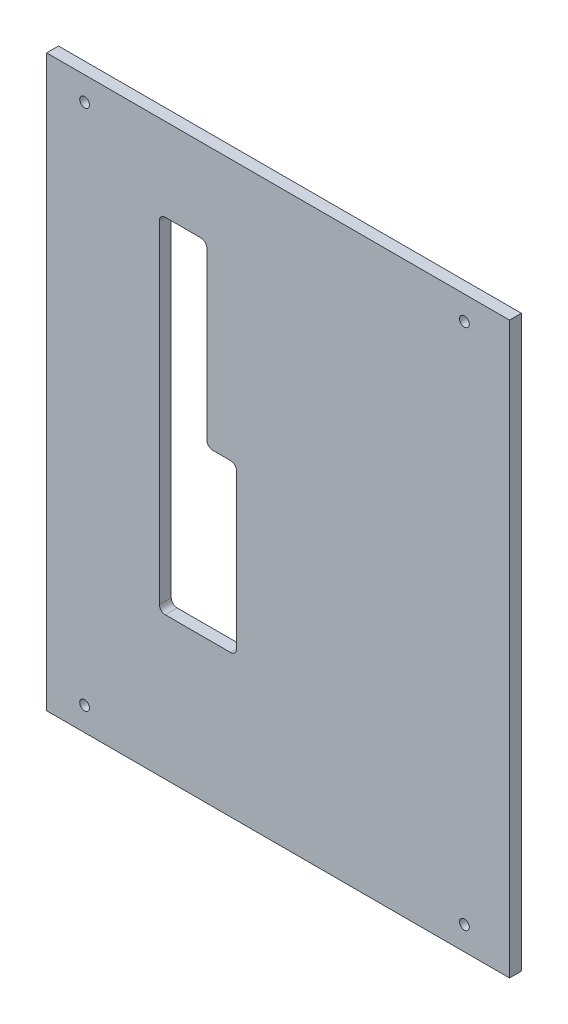
ISO-10303-21;
HEADER;
FILE_DESCRIPTION(('STEP AP214'),'2;1');
FILE_NAME('part.step','',(''),(''),'','','');
FILE_SCHEMA(('AUTOMOTIVE_DESIGN { 1 0 10303 214 1 1 1 1 }'));
ENDSEC;
DATA;
#1=APPLICATION_CONTEXT('core data for automotive mechanical design processes');
#2=APPLICATION_PROTOCOL_DEFINITION('international standard','automotive_design',2000,#1);
#3=PRODUCT_CONTEXT('',#1,'mechanical');
#4=PRODUCT('Part','Part','',(#3));
#5=PRODUCT_RELATED_PRODUCT_CATEGORY('part','',(#4));
#6=PRODUCT_DEFINITION_FORMATION('','',#4);
#7=PRODUCT_DEFINITION_CONTEXT('part definition',#1,'design');
#8=PRODUCT_DEFINITION('design','',#6,#7);
#9=PRODUCT_DEFINITION_SHAPE('','',#8);
#10=(LENGTH_UNIT() NAMED_UNIT(*) SI_UNIT(.MILLI.,.METRE.));
#11=(NAMED_UNIT(*) PLANE_ANGLE_UNIT() SI_UNIT($,.RADIAN.));
#12=(NAMED_UNIT(*) SI_UNIT($,.STERADIAN.) SOLID_ANGLE_UNIT());
#13=UNCERTAINTY_MEASURE_WITH_UNIT(LENGTH_MEASURE(1.E-05),#10,'distance_accuracy_value','');
#14=(GEOMETRIC_REPRESENTATION_CONTEXT(3) GLOBAL_UNCERTAINTY_ASSIGNED_CONTEXT((#13)) GLOBAL_UNIT_ASSIGNED_CONTEXT((#10,
#11,#12)) REPRESENTATION_CONTEXT('',''));
#15=CARTESIAN_POINT('',(0.,0.,0.));
#16=DIRECTION('',(0.,0.,1.));
#17=DIRECTION('',(1.,0.,0.));
#18=AXIS2_PLACEMENT_3D('',#15,#16,#17);
#19=CARTESIAN_POINT('',(-120.,0.,5.));
#20=DIRECTION('',(-1.,0.,0.));
#21=DIRECTION('',(0.,0.,1.));
#22=AXIS2_PLACEMENT_3D('',#19,#20,#21);
#23=PLANE('',#22);
#24=DIRECTION('',(0.,1.,0.));
#25=VECTOR('',#24,1.);
#26=CARTESIAN_POINT('',(-120.,0.,0.));
#27=LINE('',#26,#25);
#28=CARTESIAN_POINT('',(-120.,-120.,0.));
#29=VERTEX_POINT('',#28);
#30=CARTESIAN_POINT('',(-120.,120.,0.));
#31=VERTEX_POINT('',#30);
#32=EDGE_CURVE('E153',#29,#31,#27,.T.);
#33=ORIENTED_EDGE('',*,*,#32,.F.);
#34=DIRECTION('',(0.,0.,-1.));
#35=VECTOR('',#34,1.);
#36=CARTESIAN_POINT('',(-120.,-120.,5.));
#37=LINE('',#36,#35);
#38=CARTESIAN_POINT('',(-120.,-120.,5.));
#39=VERTEX_POINT('',#38);
#40=EDGE_CURVE('E149',#39,#29,#37,.T.);
#41=ORIENTED_EDGE('',*,*,#40,.F.);
#42=DIRECTION('',(0.,1.,0.));
#43=VECTOR('',#42,1.);
#44=CARTESIAN_POINT('',(-120.,0.,5.));
#45=LINE('',#44,#43);
#46=CARTESIAN_POINT('',(-120.,120.,5.));
#47=VERTEX_POINT('',#46);
#48=EDGE_CURVE('E151',#39,#47,#45,.T.);
#49=ORIENTED_EDGE('',*,*,#48,.T.);
#50=DIRECTION('',(0.,0.,-1.));
#51=VECTOR('',#50,1.);
#52=CARTESIAN_POINT('',(-120.,120.,5.));
#53=LINE('',#52,#51);
#54=EDGE_CURVE('E182',#47,#31,#53,.T.);
#55=ORIENTED_EDGE('',*,*,#54,.T.);
#56=EDGE_LOOP('',(#33,#41,#49,#55));
#57=FACE_BOUND('',#56,.T.);
#58=ADVANCED_FACE('F35',(#57),#23,.T.);
#59=CARTESIAN_POINT('',(0.,-120.,5.));
#60=DIRECTION('',(0.,-1.,0.));
#61=DIRECTION('',(1.,0.,0.));
#62=AXIS2_PLACEMENT_3D('',#59,#60,#61);
#63=PLANE('',#62);
#64=DIRECTION('',(-1.,0.,0.));
#65=VECTOR('',#64,1.);
#66=CARTESIAN_POINT('',(0.,-120.,0.));
#67=LINE('',#66,#65);
#68=CARTESIAN_POINT('',(75.,-120.,0.));
#69=VERTEX_POINT('',#68);
#70=EDGE_CURVE('E210',#69,#29,#67,.T.);
#71=ORIENTED_EDGE('',*,*,#70,.F.);
#72=DIRECTION('',(0.,0.,-1.));
#73=VECTOR('',#72,1.);
#74=CARTESIAN_POINT('',(75.,-120.,5.));
#75=LINE('',#74,#73);
#76=CARTESIAN_POINT('',(75.,-120.,5.));
#77=VERTEX_POINT('',#76);
#78=EDGE_CURVE('E159',#77,#69,#75,.T.);
#79=ORIENTED_EDGE('',*,*,#78,.F.);
#80=DIRECTION('',(-1.,0.,0.));
#81=VECTOR('',#80,1.);
#82=CARTESIAN_POINT('',(0.,-120.,5.));
#83=LINE('',#82,#81);
#84=EDGE_CURVE('E166',#77,#39,#83,.T.);
#85=ORIENTED_EDGE('',*,*,#84,.T.);
#86=ORIENTED_EDGE('',*,*,#40,.T.);
#87=EDGE_LOOP('',(#71,#79,#85,#86));
#88=FACE_BOUND('',#87,.T.);
#89=ADVANCED_FACE('F171',(#88),#63,.T.);
#90=CARTESIAN_POINT('',(75.,0.,5.));
#91=DIRECTION('',(-1.,0.,0.));
#92=DIRECTION('',(0.,0.,1.));
#93=AXIS2_PLACEMENT_3D('',#90,#91,#92);
#94=PLANE('',#93);
#95=DIRECTION('',(0.,1.,0.));
#96=VECTOR('',#95,1.);
#97=CARTESIAN_POINT('',(75.,0.,0.));
#98=LINE('',#97,#96);
#99=CARTESIAN_POINT('',(75.,120.,0.));
#100=VERTEX_POINT('',#99);
#101=EDGE_CURVE('E212',#69,#100,#98,.T.);
#102=ORIENTED_EDGE('',*,*,#101,.T.);
#103=DIRECTION('',(0.,0.,-1.));
#104=VECTOR('',#103,1.);
#105=CARTESIAN_POINT('',(75.,120.,5.));
#106=LINE('',#105,#104);
#107=CARTESIAN_POINT('',(75.,120.,5.));
#108=VERTEX_POINT('',#107);
#109=EDGE_CURVE('E223',#108,#100,#106,.T.);
#110=ORIENTED_EDGE('',*,*,#109,.F.);
#111=DIRECTION('',(0.,1.,0.));
#112=VECTOR('',#111,1.);
#113=CARTESIAN_POINT('',(75.,0.,5.));
#114=LINE('',#113,#112);
#115=EDGE_CURVE('E173',#77,#108,#114,.T.);
#116=ORIENTED_EDGE('',*,*,#115,.F.);
#117=ORIENTED_EDGE('',*,*,#78,.T.);
#118=EDGE_LOOP('',(#102,#110,#116,#117));
#119=FACE_BOUND('',#118,.T.);
#120=ADVANCED_FACE('F332',(#119),#94,.F.);
#121=CARTESIAN_POINT('',(0.,85.,5.));
#122=DIRECTION('',(0.,-1.,0.));
#123=DIRECTION('',(1.,0.,0.));
#124=AXIS2_PLACEMENT_3D('',#121,#122,#123);
#125=PLANE('',#124);
#126=DIRECTION('',(-1.,0.,0.));
#127=VECTOR('',#126,1.);
#128=CARTESIAN_POINT('',(0.,85.,0.));
#129=LINE('',#128,#127);
#130=CARTESIAN_POINT('',(-55.0000000000001,85.,0.));
#131=VERTEX_POINT('',#130);
#132=CARTESIAN_POINT('',(-70.,85.,0.));
#133=VERTEX_POINT('',#132);
#134=EDGE_CURVE('E183',#131,#133,#129,.T.);
#135=ORIENTED_EDGE('',*,*,#134,.F.);
#136=DIRECTION('',(0.,0.,-1.));
#137=VECTOR('',#136,1.);
#138=CARTESIAN_POINT('',(-55.0000000000001,85.,5.));
#139=LINE('',#138,#137);
#140=CARTESIAN_POINT('',(-55.0000000000001,85.,5.));
#141=VERTEX_POINT('',#140);
#142=EDGE_CURVE('E249',#131,#141,#139,.F.);
#143=ORIENTED_EDGE('',*,*,#142,.T.);
#144=DIRECTION('',(-1.,0.,0.));
#145=VECTOR('',#144,1.);
#146=CARTESIAN_POINT('',(0.,85.,5.));
#147=LINE('',#146,#145);
#148=CARTESIAN_POINT('',(-70.,85.,5.));
#149=VERTEX_POINT('',#148);
#150=EDGE_CURVE('E221',#141,#149,#147,.T.);
#151=ORIENTED_EDGE('',*,*,#150,.T.);
#152=DIRECTION('',(0.,0.,-1.));
#153=VECTOR('',#152,1.);
#154=CARTESIAN_POINT('',(-70.,85.,5.));
#155=LINE('',#154,#153);
#156=EDGE_CURVE('E246',#149,#133,#155,.T.);
#157=ORIENTED_EDGE('',*,*,#156,.T.);
#158=EDGE_LOOP('',(#135,#143,#151,#157));
#159=FACE_BOUND('',#158,.T.);
#160=ADVANCED_FACE('F361',(#159),#125,.T.);
#161=CARTESIAN_POINT('',(-52.5,0.,5.));
#162=DIRECTION('',(1.,0.,0.));
#163=DIRECTION('',(0.,1.,0.));
#164=AXIS2_PLACEMENT_3D('',#161,#162,#163);
#165=PLANE('',#164);
#166=DIRECTION('',(0.,-1.,0.));
#167=VECTOR('',#166,1.);
#168=CARTESIAN_POINT('',(-52.5,0.,5.));
#169=LINE('',#168,#167);
#170=CARTESIAN_POINT('',(-52.5000000000001,82.5,5.));
#171=VERTEX_POINT('',#170);
#172=CARTESIAN_POINT('',(-52.5,12.5,5.));
#173=VERTEX_POINT('',#172);
#174=EDGE_CURVE('E298',#171,#173,#169,.T.);
#175=ORIENTED_EDGE('',*,*,#174,.F.);
#176=DIRECTION('',(0.,0.,-1.));
#177=VECTOR('',#176,1.);
#178=CARTESIAN_POINT('',(-52.5000000000001,82.5,5.));
#179=LINE('',#178,#177);
#180=CARTESIAN_POINT('',(-52.5000000000001,82.5,0.));
#181=VERTEX_POINT('',#180);
#182=EDGE_CURVE('E243',#171,#181,#179,.T.);
#183=ORIENTED_EDGE('',*,*,#182,.T.);
#184=DIRECTION('',(0.,-1.,0.));
#185=VECTOR('',#184,1.);
#186=CARTESIAN_POINT('',(-52.5,0.,0.));
#187=LINE('',#186,#185);
#188=CARTESIAN_POINT('',(-52.5,12.5,0.));
#189=VERTEX_POINT('',#188);
#190=EDGE_CURVE('E186',#181,#189,#187,.T.);
#191=ORIENTED_EDGE('',*,*,#190,.T.);
#192=DIRECTION('',(0.,0.,-1.));
#193=VECTOR('',#192,1.);
#194=CARTESIAN_POINT('',(-52.5,12.5,5.));
#195=LINE('',#194,#193);
#196=EDGE_CURVE('E241',#189,#173,#195,.F.);
#197=ORIENTED_EDGE('',*,*,#196,.T.);
#198=EDGE_LOOP('',(#175,#183,#191,#197));
#199=FACE_BOUND('',#198,.T.);
#200=ADVANCED_FACE('F358',(#199),#165,.F.);
#201=CARTESIAN_POINT('',(0.,9.99999999999998,5.));
#202=DIRECTION('',(0.,1.,0.));
#203=DIRECTION('',(0.,0.,1.));
#204=AXIS2_PLACEMENT_3D('',#201,#202,#203);
#205=PLANE('',#204);
#206=DIRECTION('',(1.,0.,0.));
#207=VECTOR('',#206,1.);
#208=CARTESIAN_POINT('',(0.,9.99999999999998,0.));
#209=LINE('',#208,#207);
#210=CARTESIAN_POINT('',(-50.,9.99999999999998,0.));
#211=VERTEX_POINT('',#210);
#212=CARTESIAN_POINT('',(-42.5,9.99999999999998,0.));
#213=VERTEX_POINT('',#212);
#214=EDGE_CURVE('E189',#211,#213,#209,.T.);
#215=ORIENTED_EDGE('',*,*,#214,.T.);
#216=DIRECTION('',(0.,0.,-1.));
#217=VECTOR('',#216,1.);
#218=CARTESIAN_POINT('',(-42.5,9.99999999999998,5.));
#219=LINE('',#218,#217);
#220=CARTESIAN_POINT('',(-42.5,9.99999999999998,5.));
#221=VERTEX_POINT('',#220);
#222=EDGE_CURVE('E50',#213,#221,#219,.F.);
#223=ORIENTED_EDGE('',*,*,#222,.T.);
#224=DIRECTION('',(1.,0.,0.));
#225=VECTOR('',#224,1.);
#226=CARTESIAN_POINT('',(0.,9.99999999999998,5.));
#227=LINE('',#226,#225);
#228=CARTESIAN_POINT('',(-50.,9.99999999999998,5.));
#229=VERTEX_POINT('',#228);
#230=EDGE_CURVE('E289',#229,#221,#227,.T.);
#231=ORIENTED_EDGE('',*,*,#230,.F.);
#232=DIRECTION('',(0.,0.,-1.));
#233=VECTOR('',#232,1.);
#234=CARTESIAN_POINT('',(-50.,9.99999999999998,5.));
#235=LINE('',#234,#233);
#236=EDGE_CURVE('E251',#229,#211,#235,.T.);
#237=ORIENTED_EDGE('',*,*,#236,.T.);
#238=EDGE_LOOP('',(#215,#223,#231,#237));
#239=FACE_BOUND('',#238,.T.);
#240=ADVANCED_FACE('F280',(#239),#205,.F.);
#241=CARTESIAN_POINT('',(-40.,0.,5.));
#242=DIRECTION('',(-1.,0.,0.));
#243=DIRECTION('',(0.,0.,1.));
#244=AXIS2_PLACEMENT_3D('',#241,#242,#243);
#245=PLANE('',#244);
#246=DIRECTION('',(0.,1.,0.));
#247=VECTOR('',#246,1.);
#248=CARTESIAN_POINT('',(-40.,0.,0.));
#249=LINE('',#248,#247);
#250=CARTESIAN_POINT('',(-40.,-57.5,0.));
#251=VERTEX_POINT('',#250);
#252=CARTESIAN_POINT('',(-40.,7.49999999999998,0.));
#253=VERTEX_POINT('',#252);
#254=EDGE_CURVE('E191',#251,#253,#249,.T.);
#255=ORIENTED_EDGE('',*,*,#254,.F.);
#256=DIRECTION('',(0.,0.,-1.));
#257=VECTOR('',#256,1.);
#258=CARTESIAN_POINT('',(-40.,-57.5,5.));
#259=LINE('',#258,#257);
#260=CARTESIAN_POINT('',(-40.,-57.5,5.));
#261=VERTEX_POINT('',#260);
#262=EDGE_CURVE('E239',#251,#261,#259,.F.);
#263=ORIENTED_EDGE('',*,*,#262,.T.);
#264=DIRECTION('',(0.,1.,0.));
#265=VECTOR('',#264,1.);
#266=CARTESIAN_POINT('',(-40.,0.,5.));
#267=LINE('',#266,#265);
#268=CARTESIAN_POINT('',(-40.,7.49999999999998,5.));
#269=VERTEX_POINT('',#268);
#270=EDGE_CURVE('E287',#261,#269,#267,.T.);
#271=ORIENTED_EDGE('',*,*,#270,.T.);
#272=DIRECTION('',(0.,0.,-1.));
#273=VECTOR('',#272,1.);
#274=CARTESIAN_POINT('',(-40.,7.49999999999998,5.));
#275=LINE('',#274,#273);
#276=EDGE_CURVE('E236',#269,#253,#275,.T.);
#277=ORIENTED_EDGE('',*,*,#276,.T.);
#278=EDGE_LOOP('',(#255,#263,#271,#277));
#279=FACE_BOUND('',#278,.T.);
#280=ADVANCED_FACE('F291',(#279),#245,.T.);
#281=CARTESIAN_POINT('',(0.,-60.,5.));
#282=DIRECTION('',(0.,-1.,0.));
#283=DIRECTION('',(1.,0.,0.));
#284=AXIS2_PLACEMENT_3D('',#281,#282,#283);
#285=PLANE('',#284);
#286=DIRECTION('',(-1.,0.,0.));
#287=VECTOR('',#286,1.);
#288=CARTESIAN_POINT('',(0.,-60.,0.));
#289=LINE('',#288,#287);
#290=CARTESIAN_POINT('',(-42.5,-60.,0.));
#291=VERTEX_POINT('',#290);
#292=CARTESIAN_POINT('',(-70.,-60.,0.));
#293=VERTEX_POINT('',#292);
#294=EDGE_CURVE('E194',#291,#293,#289,.T.);
#295=ORIENTED_EDGE('',*,*,#294,.T.);
#296=DIRECTION('',(0.,0.,-1.));
#297=VECTOR('',#296,1.);
#298=CARTESIAN_POINT('',(-70.,-60.,5.));
#299=LINE('',#298,#297);
#300=CARTESIAN_POINT('',(-70.,-60.,5.));
#301=VERTEX_POINT('',#300);
#302=EDGE_CURVE('E234',#293,#301,#299,.F.);
#303=ORIENTED_EDGE('',*,*,#302,.T.);
#304=DIRECTION('',(-1.,0.,0.));
#305=VECTOR('',#304,1.);
#306=CARTESIAN_POINT('',(0.,-60.,5.));
#307=LINE('',#306,#305);
#308=CARTESIAN_POINT('',(-42.5,-60.,5.));
#309=VERTEX_POINT('',#308);
#310=EDGE_CURVE('E293',#309,#301,#307,.T.);
#311=ORIENTED_EDGE('',*,*,#310,.F.);
#312=DIRECTION('',(0.,0.,-1.));
#313=VECTOR('',#312,1.);
#314=CARTESIAN_POINT('',(-42.5,-60.,5.));
#315=LINE('',#314,#313);
#316=EDGE_CURVE('E231',#309,#291,#315,.T.);
#317=ORIENTED_EDGE('',*,*,#316,.T.);
#318=EDGE_LOOP('',(#295,#303,#311,#317));
#319=FACE_BOUND('',#318,.T.);
#320=ADVANCED_FACE('F350',(#319),#285,.F.);
#321=CARTESIAN_POINT('',(0.,120.,5.));
#322=DIRECTION('',(0.,-1.,0.));
#323=DIRECTION('',(1.,0.,0.));
#324=AXIS2_PLACEMENT_3D('',#321,#322,#323);
#325=PLANE('',#324);
#326=DIRECTION('',(-1.,0.,0.));
#327=VECTOR('',#326,1.);
#328=CARTESIAN_POINT('',(0.,120.,0.));
#329=LINE('',#328,#327);
#330=EDGE_CURVE('E215',#100,#31,#329,.T.);
#331=ORIENTED_EDGE('',*,*,#330,.T.);
#332=ORIENTED_EDGE('',*,*,#54,.F.);
#333=DIRECTION('',(-1.,0.,0.));
#334=VECTOR('',#333,1.);
#335=CARTESIAN_POINT('',(0.,120.,5.));
#336=LINE('',#335,#334);
#337=EDGE_CURVE('E167',#108,#47,#336,.T.);
#338=ORIENTED_EDGE('',*,*,#337,.F.);
#339=ORIENTED_EDGE('',*,*,#109,.T.);
#340=EDGE_LOOP('',(#331,#332,#338,#339));
#341=FACE_BOUND('',#340,.T.);
#342=ADVANCED_FACE('F339',(#341),#325,.F.);
#343=CARTESIAN_POINT('',(-104.,110.,5.));
#344=DIRECTION('',(0.,0.,-1.));
#345=DIRECTION('',(-1.,0.,0.));
#346=AXIS2_PLACEMENT_3D('',#343,#344,#345);
#347=CYLINDRICAL_SURFACE('',#346,2.04999999999999);
#348=CARTESIAN_POINT('',(-104.,110.,5.));
#349=DIRECTION('',(0.,0.,1.));
#350=DIRECTION('',(1.,0.,0.));
#351=AXIS2_PLACEMENT_3D('',#348,#349,#350);
#352=CIRCLE('',#351,2.04999999999999);
#353=CARTESIAN_POINT('',(-101.95,110.,5.));
#354=VERTEX_POINT('',#353);
#355=EDGE_CURVE('E169',#354,#354,#352,.T.);
#356=ORIENTED_EDGE('',*,*,#355,.T.);
#357=EDGE_LOOP('',(#356));
#358=FACE_BOUND('',#357,.T.);
#359=CARTESIAN_POINT('',(-104.,110.,0.));
#360=DIRECTION('',(0.,0.,1.));
#361=DIRECTION('',(1.,0.,0.));
#362=AXIS2_PLACEMENT_3D('',#359,#360,#361);
#363=CIRCLE('',#362,2.04999999999999);
#364=CARTESIAN_POINT('',(-101.95,110.,0.));
#365=VERTEX_POINT('',#364);
#366=EDGE_CURVE('E206',#365,#365,#363,.T.);
#367=ORIENTED_EDGE('',*,*,#366,.F.);
#368=EDGE_LOOP('',(#367));
#369=FACE_BOUND('',#368,.T.);
#370=ADVANCED_FACE('F312',(#358,#369),#347,.F.);
#371=CARTESIAN_POINT('',(56.,110.,5.));
#372=DIRECTION('',(0.,0.,-1.));
#373=DIRECTION('',(-1.,0.,0.));
#374=AXIS2_PLACEMENT_3D('',#371,#372,#373);
#375=CYLINDRICAL_SURFACE('',#374,2.04999999999999);
#376=CARTESIAN_POINT('',(56.,110.,5.));
#377=DIRECTION('',(0.,0.,1.));
#378=DIRECTION('',(1.,0.,0.));
#379=AXIS2_PLACEMENT_3D('',#376,#377,#378);
#380=CIRCLE('',#379,2.04999999999999);
#381=CARTESIAN_POINT('',(58.05,110.,5.));
#382=VERTEX_POINT('',#381);
#383=EDGE_CURVE('E307',#382,#382,#380,.T.);
#384=ORIENTED_EDGE('',*,*,#383,.T.);
#385=EDGE_LOOP('',(#384));
#386=FACE_BOUND('',#385,.T.);
#387=CARTESIAN_POINT('',(56.,110.,0.));
#388=DIRECTION('',(0.,0.,1.));
#389=DIRECTION('',(1.,0.,0.));
#390=AXIS2_PLACEMENT_3D('',#387,#388,#389);
#391=CIRCLE('',#390,2.04999999999999);
#392=CARTESIAN_POINT('',(58.05,110.,0.));
#393=VERTEX_POINT('',#392);
#394=EDGE_CURVE('E203',#393,#393,#391,.T.);
#395=ORIENTED_EDGE('',*,*,#394,.F.);
#396=EDGE_LOOP('',(#395));
#397=FACE_BOUND('',#396,.T.);
#398=ADVANCED_FACE('F338',(#386,#397),#375,.F.);
#399=CARTESIAN_POINT('',(56.,-110.,5.));
#400=DIRECTION('',(0.,0.,-1.));
#401=DIRECTION('',(-1.,0.,0.));
#402=AXIS2_PLACEMENT_3D('',#399,#400,#401);
#403=CYLINDRICAL_SURFACE('',#402,2.04999999999999);
#404=CARTESIAN_POINT('',(56.,-110.,5.));
#405=DIRECTION('',(0.,0.,1.));
#406=DIRECTION('',(1.,0.,0.));
#407=AXIS2_PLACEMENT_3D('',#404,#405,#406);
#408=CIRCLE('',#407,2.04999999999999);
#409=CARTESIAN_POINT('',(58.05,-110.,5.));
#410=VERTEX_POINT('',#409);
#411=EDGE_CURVE('E304',#410,#410,#408,.F.);
#412=ORIENTED_EDGE('',*,*,#411,.F.);
#413=EDGE_LOOP('',(#412));
#414=FACE_BOUND('',#413,.T.);
#415=CARTESIAN_POINT('',(56.,-110.,0.));
#416=DIRECTION('',(0.,0.,1.));
#417=DIRECTION('',(1.,0.,0.));
#418=AXIS2_PLACEMENT_3D('',#415,#416,#417);
#419=CIRCLE('',#418,2.04999999999999);
#420=CARTESIAN_POINT('',(58.05,-110.,0.));
#421=VERTEX_POINT('',#420);
#422=EDGE_CURVE('E200',#421,#421,#419,.F.);
#423=ORIENTED_EDGE('',*,*,#422,.T.);
#424=EDGE_LOOP('',(#423));
#425=FACE_BOUND('',#424,.T.);
#426=ADVANCED_FACE('F342',(#414,#425),#403,.F.);
#427=CARTESIAN_POINT('',(-72.5,0.,5.));
#428=DIRECTION('',(-1.,0.,0.));
#429=DIRECTION('',(0.,-1.,0.));
#430=AXIS2_PLACEMENT_3D('',#427,#428,#429);
#431=PLANE('',#430);
#432=DIRECTION('',(0.,1.,0.));
#433=VECTOR('',#432,1.);
#434=CARTESIAN_POINT('',(-72.5,0.,5.));
#435=LINE('',#434,#433);
#436=CARTESIAN_POINT('',(-72.5,-57.5,5.));
#437=VERTEX_POINT('',#436);
#438=CARTESIAN_POINT('',(-72.5000000000001,82.5,5.));
#439=VERTEX_POINT('',#438);
#440=EDGE_CURVE('E296',#437,#439,#435,.T.);
#441=ORIENTED_EDGE('',*,*,#440,.F.);
#442=DIRECTION('',(0.,0.,-1.));
#443=VECTOR('',#442,1.);
#444=CARTESIAN_POINT('',(-72.5,-57.5,0.));
#445=LINE('',#444,#443);
#446=CARTESIAN_POINT('',(-72.5,-57.5,0.));
#447=VERTEX_POINT('',#446);
#448=EDGE_CURVE('E228',#437,#447,#445,.T.);
#449=ORIENTED_EDGE('',*,*,#448,.T.);
#450=DIRECTION('',(0.,1.,0.));
#451=VECTOR('',#450,1.);
#452=CARTESIAN_POINT('',(-72.5,0.,0.));
#453=LINE('',#452,#451);
#454=CARTESIAN_POINT('',(-72.5000000000001,82.5,0.));
#455=VERTEX_POINT('',#454);
#456=EDGE_CURVE('E197',#447,#455,#453,.T.);
#457=ORIENTED_EDGE('',*,*,#456,.T.);
#458=DIRECTION('',(0.,0.,-1.));
#459=VECTOR('',#458,1.);
#460=CARTESIAN_POINT('',(-72.5000000000001,82.5,5.));
#461=LINE('',#460,#459);
#462=EDGE_CURVE('E158',#455,#439,#461,.F.);
#463=ORIENTED_EDGE('',*,*,#462,.T.);
#464=EDGE_LOOP('',(#441,#449,#457,#463));
#465=FACE_BOUND('',#464,.T.);
#466=ADVANCED_FACE('F324',(#465),#431,.F.);
#467=CARTESIAN_POINT('',(-104.,-110.,5.));
#468=DIRECTION('',(0.,0.,-1.));
#469=DIRECTION('',(-1.,0.,0.));
#470=AXIS2_PLACEMENT_3D('',#467,#468,#469);
#471=CYLINDRICAL_SURFACE('',#470,2.04999999999999);
#472=CARTESIAN_POINT('',(-104.,-110.,5.));
#473=DIRECTION('',(0.,0.,1.));
#474=DIRECTION('',(1.,0.,0.));
#475=AXIS2_PLACEMENT_3D('',#472,#473,#474);
#476=CIRCLE('',#475,2.04999999999999);
#477=CARTESIAN_POINT('',(-101.95,-110.,5.));
#478=VERTEX_POINT('',#477);
#479=EDGE_CURVE('E179',#478,#478,#476,.F.);
#480=ORIENTED_EDGE('',*,*,#479,.F.);
#481=EDGE_LOOP('',(#480));
#482=FACE_BOUND('',#481,.T.);
#483=CARTESIAN_POINT('',(-104.,-110.,0.));
#484=DIRECTION('',(0.,0.,1.));
#485=DIRECTION('',(1.,0.,0.));
#486=AXIS2_PLACEMENT_3D('',#483,#484,#485);
#487=CIRCLE('',#486,2.04999999999999);
#488=CARTESIAN_POINT('',(-101.95,-110.,0.));
#489=VERTEX_POINT('',#488);
#490=EDGE_CURVE('E218',#489,#489,#487,.F.);
#491=ORIENTED_EDGE('',*,*,#490,.T.);
#492=EDGE_LOOP('',(#491));
#493=FACE_BOUND('',#492,.T.);
#494=ADVANCED_FACE('F316',(#482,#493),#471,.F.);
#495=CARTESIAN_POINT('',(0.,0.,5.));
#496=DIRECTION('',(0.,0.,1.));
#497=DIRECTION('',(1.,0.,0.));
#498=AXIS2_PLACEMENT_3D('',#495,#496,#497);
#499=PLANE('',#498);
#500=ORIENTED_EDGE('',*,*,#174,.T.);
#501=CARTESIAN_POINT('',(-50.,12.5,5.));
#502=DIRECTION('',(0.,0.,1.));
#503=DIRECTION('',(1.,0.,0.));
#504=AXIS2_PLACEMENT_3D('',#501,#502,#503);
#505=CIRCLE('',#504,2.5);
#506=EDGE_CURVE('E57',#173,#229,#505,.T.);
#507=ORIENTED_EDGE('',*,*,#506,.T.);
#508=ORIENTED_EDGE('',*,*,#230,.T.);
#509=CARTESIAN_POINT('',(-42.5,7.49999999999998,5.));
#510=DIRECTION('',(0.,0.,1.));
#511=DIRECTION('',(1.,0.,0.));
#512=AXIS2_PLACEMENT_3D('',#509,#510,#511);
#513=CIRCLE('',#512,2.5);
#514=EDGE_CURVE('E11',#221,#269,#513,.F.);
#515=ORIENTED_EDGE('',*,*,#514,.T.);
#516=ORIENTED_EDGE('',*,*,#270,.F.);
#517=CARTESIAN_POINT('',(-42.5,-57.5,5.));
#518=DIRECTION('',(0.,0.,1.));
#519=DIRECTION('',(1.,0.,0.));
#520=AXIS2_PLACEMENT_3D('',#517,#518,#519);
#521=CIRCLE('',#520,2.5);
#522=EDGE_CURVE('E264',#261,#309,#521,.F.);
#523=ORIENTED_EDGE('',*,*,#522,.T.);
#524=ORIENTED_EDGE('',*,*,#310,.T.);
#525=CARTESIAN_POINT('',(-70.,-57.5,5.));
#526=DIRECTION('',(0.,0.,1.));
#527=DIRECTION('',(1.,0.,0.));
#528=AXIS2_PLACEMENT_3D('',#525,#526,#527);
#529=CIRCLE('',#528,2.5);
#530=EDGE_CURVE('E260',#301,#437,#529,.F.);
#531=ORIENTED_EDGE('',*,*,#530,.T.);
#532=ORIENTED_EDGE('',*,*,#440,.T.);
#533=CARTESIAN_POINT('',(-70.,82.5,5.));
#534=DIRECTION('',(0.,0.,1.));
#535=DIRECTION('',(1.,0.,0.));
#536=AXIS2_PLACEMENT_3D('',#533,#534,#535);
#537=CIRCLE('',#536,2.5);
#538=EDGE_CURVE('E272',#439,#149,#537,.F.);
#539=ORIENTED_EDGE('',*,*,#538,.T.);
#540=ORIENTED_EDGE('',*,*,#150,.F.);
#541=CARTESIAN_POINT('',(-55.0000000000001,82.5,5.));
#542=DIRECTION('',(0.,0.,1.));
#543=DIRECTION('',(1.,0.,0.));
#544=AXIS2_PLACEMENT_3D('',#541,#542,#543);
#545=CIRCLE('',#544,2.5);
#546=EDGE_CURVE('E268',#141,#171,#545,.F.);
#547=ORIENTED_EDGE('',*,*,#546,.T.);
#548=EDGE_LOOP('',(#500,#507,#508,#515,#516,#523,#524,#531,#532,#539,#540,#547));
#549=FACE_BOUND('',#548,.T.);
#550=ORIENTED_EDGE('',*,*,#411,.T.);
#551=EDGE_LOOP('',(#550));
#552=FACE_BOUND('',#551,.T.);
#553=ORIENTED_EDGE('',*,*,#383,.F.);
#554=EDGE_LOOP('',(#553));
#555=FACE_BOUND('',#554,.T.);
#556=ORIENTED_EDGE('',*,*,#355,.F.);
#557=EDGE_LOOP('',(#556));
#558=FACE_BOUND('',#557,.T.);
#559=ORIENTED_EDGE('',*,*,#48,.F.);
#560=ORIENTED_EDGE('',*,*,#84,.F.);
#561=ORIENTED_EDGE('',*,*,#115,.T.);
#562=ORIENTED_EDGE('',*,*,#337,.T.);
#563=EDGE_LOOP('',(#559,#560,#561,#562));
#564=FACE_BOUND('',#563,.T.);
#565=ORIENTED_EDGE('',*,*,#479,.T.);
#566=EDGE_LOOP('',(#565));
#567=FACE_BOUND('',#566,.T.);
#568=ADVANCED_FACE('F163',(#549,#552,#555,#558,#564,#567),#499,.T.);
#569=CARTESIAN_POINT('',(0.,0.,0.));
#570=DIRECTION('',(0.,0.,1.));
#571=DIRECTION('',(1.,0.,0.));
#572=AXIS2_PLACEMENT_3D('',#569,#570,#571);
#573=PLANE('',#572);
#574=ORIENTED_EDGE('',*,*,#214,.F.);
#575=CARTESIAN_POINT('',(-50.,12.5,0.));
#576=DIRECTION('',(0.,0.,1.));
#577=DIRECTION('',(1.,0.,0.));
#578=AXIS2_PLACEMENT_3D('',#575,#576,#577);
#579=CIRCLE('',#578,2.5);
#580=EDGE_CURVE('E255',#211,#189,#579,.F.);
#581=ORIENTED_EDGE('',*,*,#580,.T.);
#582=ORIENTED_EDGE('',*,*,#190,.F.);
#583=CARTESIAN_POINT('',(-55.0000000000001,82.5,0.));
#584=DIRECTION('',(0.,0.,1.));
#585=DIRECTION('',(1.,0.,0.));
#586=AXIS2_PLACEMENT_3D('',#583,#584,#585);
#587=CIRCLE('',#586,2.5);
#588=EDGE_CURVE('E266',#181,#131,#587,.T.);
#589=ORIENTED_EDGE('',*,*,#588,.T.);
#590=ORIENTED_EDGE('',*,*,#134,.T.);
#591=CARTESIAN_POINT('',(-70.,82.5,0.));
#592=DIRECTION('',(0.,0.,1.));
#593=DIRECTION('',(1.,0.,0.));
#594=AXIS2_PLACEMENT_3D('',#591,#592,#593);
#595=CIRCLE('',#594,2.5);
#596=EDGE_CURVE('E270',#133,#455,#595,.T.);
#597=ORIENTED_EDGE('',*,*,#596,.T.);
#598=ORIENTED_EDGE('',*,*,#456,.F.);
#599=CARTESIAN_POINT('',(-70.,-57.5,0.));
#600=DIRECTION('',(0.,0.,1.));
#601=DIRECTION('',(1.,0.,0.));
#602=AXIS2_PLACEMENT_3D('',#599,#600,#601);
#603=CIRCLE('',#602,2.5);
#604=EDGE_CURVE('E258',#447,#293,#603,.T.);
#605=ORIENTED_EDGE('',*,*,#604,.T.);
#606=ORIENTED_EDGE('',*,*,#294,.F.);
#607=CARTESIAN_POINT('',(-42.5,-57.5,0.));
#608=DIRECTION('',(0.,0.,1.));
#609=DIRECTION('',(1.,0.,0.));
#610=AXIS2_PLACEMENT_3D('',#607,#608,#609);
#611=CIRCLE('',#610,2.5);
#612=EDGE_CURVE('E262',#291,#251,#611,.T.);
#613=ORIENTED_EDGE('',*,*,#612,.T.);
#614=ORIENTED_EDGE('',*,*,#254,.T.);
#615=CARTESIAN_POINT('',(-42.5,7.49999999999998,0.));
#616=DIRECTION('',(0.,0.,1.));
#617=DIRECTION('',(1.,0.,0.));
#618=AXIS2_PLACEMENT_3D('',#615,#616,#617);
#619=CIRCLE('',#618,2.5);
#620=EDGE_CURVE('E43',#253,#213,#619,.T.);
#621=ORIENTED_EDGE('',*,*,#620,.T.);
#622=EDGE_LOOP('',(#574,#581,#582,#589,#590,#597,#598,#605,#606,#613,#614,#621));
#623=FACE_BOUND('',#622,.T.);
#624=ORIENTED_EDGE('',*,*,#422,.F.);
#625=EDGE_LOOP('',(#624));
#626=FACE_BOUND('',#625,.T.);
#627=ORIENTED_EDGE('',*,*,#394,.T.);
#628=EDGE_LOOP('',(#627));
#629=FACE_BOUND('',#628,.T.);
#630=ORIENTED_EDGE('',*,*,#366,.T.);
#631=EDGE_LOOP('',(#630));
#632=FACE_BOUND('',#631,.T.);
#633=ORIENTED_EDGE('',*,*,#32,.T.);
#634=ORIENTED_EDGE('',*,*,#330,.F.);
#635=ORIENTED_EDGE('',*,*,#101,.F.);
#636=ORIENTED_EDGE('',*,*,#70,.T.);
#637=EDGE_LOOP('',(#633,#634,#635,#636));
#638=FACE_BOUND('',#637,.T.);
#639=ORIENTED_EDGE('',*,*,#490,.F.);
#640=EDGE_LOOP('',(#639));
#641=FACE_BOUND('',#640,.T.);
#642=ADVANCED_FACE('F275',(#623,#626,#629,#632,#638,#641),#573,.F.);
#643=CARTESIAN_POINT('',(-70.,-57.5,5.));
#644=DIRECTION('',(0.,0.,1.));
#645=DIRECTION('',(1.,0.,0.));
#646=AXIS2_PLACEMENT_3D('',#643,#644,#645);
#647=CYLINDRICAL_SURFACE('',#646,2.5);
#648=ORIENTED_EDGE('',*,*,#530,.F.);
#649=ORIENTED_EDGE('',*,*,#302,.F.);
#650=ORIENTED_EDGE('',*,*,#604,.F.);
#651=ORIENTED_EDGE('',*,*,#448,.F.);
#652=EDGE_LOOP('',(#648,#649,#650,#651));
#653=FACE_BOUND('',#652,.T.);
#654=ADVANCED_FACE('F322',(#653),#647,.F.);
#655=CARTESIAN_POINT('',(-42.5,-57.5,5.));
#656=DIRECTION('',(0.,0.,-1.));
#657=DIRECTION('',(-1.,0.,0.));
#658=AXIS2_PLACEMENT_3D('',#655,#656,#657);
#659=CYLINDRICAL_SURFACE('',#658,2.5);
#660=ORIENTED_EDGE('',*,*,#522,.F.);
#661=ORIENTED_EDGE('',*,*,#262,.F.);
#662=ORIENTED_EDGE('',*,*,#612,.F.);
#663=ORIENTED_EDGE('',*,*,#316,.F.);
#664=EDGE_LOOP('',(#660,#661,#662,#663));
#665=FACE_BOUND('',#664,.T.);
#666=ADVANCED_FACE('F368',(#665),#659,.F.);
#667=CARTESIAN_POINT('',(-55.0000000000001,82.5,5.));
#668=DIRECTION('',(0.,0.,-1.));
#669=DIRECTION('',(-1.,0.,0.));
#670=AXIS2_PLACEMENT_3D('',#667,#668,#669);
#671=CYLINDRICAL_SURFACE('',#670,2.5);
#672=ORIENTED_EDGE('',*,*,#546,.F.);
#673=ORIENTED_EDGE('',*,*,#142,.F.);
#674=ORIENTED_EDGE('',*,*,#588,.F.);
#675=ORIENTED_EDGE('',*,*,#182,.F.);
#676=EDGE_LOOP('',(#672,#673,#674,#675));
#677=FACE_BOUND('',#676,.T.);
#678=ADVANCED_FACE('F372',(#677),#671,.F.);
#679=CARTESIAN_POINT('',(-70.,82.5,5.));
#680=DIRECTION('',(0.,0.,-1.));
#681=DIRECTION('',(-1.,0.,0.));
#682=AXIS2_PLACEMENT_3D('',#679,#680,#681);
#683=CYLINDRICAL_SURFACE('',#682,2.5);
#684=ORIENTED_EDGE('',*,*,#538,.F.);
#685=ORIENTED_EDGE('',*,*,#462,.F.);
#686=ORIENTED_EDGE('',*,*,#596,.F.);
#687=ORIENTED_EDGE('',*,*,#156,.F.);
#688=EDGE_LOOP('',(#684,#685,#686,#687));
#689=FACE_BOUND('',#688,.T.);
#690=ADVANCED_FACE('F376',(#689),#683,.F.);
#691=CARTESIAN_POINT('',(-42.5,7.49999999999998,5.));
#692=DIRECTION('',(0.,0.,-1.));
#693=DIRECTION('',(-1.,0.,0.));
#694=AXIS2_PLACEMENT_3D('',#691,#692,#693);
#695=CYLINDRICAL_SURFACE('',#694,2.5);
#696=ORIENTED_EDGE('',*,*,#514,.F.);
#697=ORIENTED_EDGE('',*,*,#222,.F.);
#698=ORIENTED_EDGE('',*,*,#620,.F.);
#699=ORIENTED_EDGE('',*,*,#276,.F.);
#700=EDGE_LOOP('',(#696,#697,#698,#699));
#701=FACE_BOUND('',#700,.T.);
#702=ADVANCED_FACE('F283',(#701),#695,.F.);
#703=CARTESIAN_POINT('',(-50.,12.5,5.));
#704=DIRECTION('',(0.,0.,-1.));
#705=DIRECTION('',(-1.,0.,0.));
#706=AXIS2_PLACEMENT_3D('',#703,#704,#705);
#707=CYLINDRICAL_SURFACE('',#706,2.5);
#708=ORIENTED_EDGE('',*,*,#506,.F.);
#709=ORIENTED_EDGE('',*,*,#196,.F.);
#710=ORIENTED_EDGE('',*,*,#580,.F.);
#711=ORIENTED_EDGE('',*,*,#236,.F.);
#712=EDGE_LOOP('',(#708,#709,#710,#711));
#713=FACE_BOUND('',#712,.T.);
#714=ADVANCED_FACE('F37',(#713),#707,.T.);
#715=CLOSED_SHELL('',(#58,#89,#120,#160,#200,#240,#280,#320,#342,#370,#398,#426,#466,#494,#568,
#642,#654,#666,#678,#690,#702,#714));
#716=MANIFOLD_SOLID_BREP('B2',#715);
#717=ADVANCED_BREP_SHAPE_REPRESENTATION('',(#18,#716),#14);
#718=SHAPE_DEFINITION_REPRESENTATION(#9,#717);
ENDSEC;
END-ISO-10303-21;
